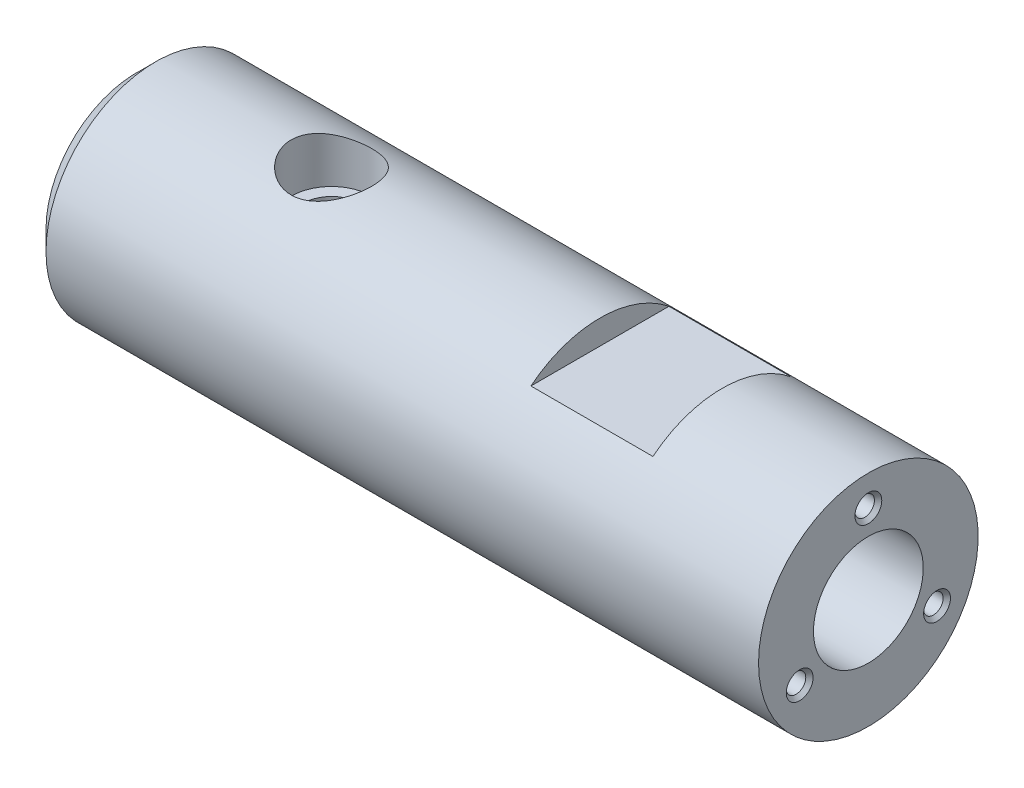
ISO-10303-21;
HEADER;
FILE_DESCRIPTION(('STEP AP214'),'2;1');
FILE_NAME('part.step','',(''),(''),'','','');
FILE_SCHEMA(('AUTOMOTIVE_DESIGN { 1 0 10303 214 1 1 1 1 }'));
ENDSEC;
DATA;
#1=APPLICATION_CONTEXT('core data for automotive mechanical design processes');
#2=APPLICATION_PROTOCOL_DEFINITION('international standard','automotive_design',2000,#1);
#3=PRODUCT_CONTEXT('',#1,'mechanical');
#4=PRODUCT('Part','Part','',(#3));
#5=PRODUCT_RELATED_PRODUCT_CATEGORY('part','',(#4));
#6=PRODUCT_DEFINITION_FORMATION('','',#4);
#7=PRODUCT_DEFINITION_CONTEXT('part definition',#1,'design');
#8=PRODUCT_DEFINITION('design','',#6,#7);
#9=PRODUCT_DEFINITION_SHAPE('','',#8);
#10=(LENGTH_UNIT() NAMED_UNIT(*) SI_UNIT(.MILLI.,.METRE.));
#11=(NAMED_UNIT(*) PLANE_ANGLE_UNIT() SI_UNIT($,.RADIAN.));
#12=(NAMED_UNIT(*) SI_UNIT($,.STERADIAN.) SOLID_ANGLE_UNIT());
#13=UNCERTAINTY_MEASURE_WITH_UNIT(LENGTH_MEASURE(1.E-05),#10,'distance_accuracy_value','');
#14=(GEOMETRIC_REPRESENTATION_CONTEXT(3) GLOBAL_UNCERTAINTY_ASSIGNED_CONTEXT((#13)) GLOBAL_UNIT_ASSIGNED_CONTEXT((#10,
#11,#12)) REPRESENTATION_CONTEXT('',''));
#15=CARTESIAN_POINT('',(0.,0.,0.));
#16=DIRECTION('',(0.,0.,1.));
#17=DIRECTION('',(1.,0.,0.));
#18=AXIS2_PLACEMENT_3D('',#15,#16,#17);
#19=CARTESIAN_POINT('',(-16.,0.,0.));
#20=DIRECTION('',(-1.,0.,0.));
#21=DIRECTION('',(0.,0.,1.));
#22=AXIS2_PLACEMENT_3D('',#19,#20,#21);
#23=CYLINDRICAL_SURFACE('',#22,2.55);
#24=CARTESIAN_POINT('',(-13.,0.,0.));
#25=DIRECTION('',(-1.,0.,0.));
#26=DIRECTION('',(0.,0.,1.));
#27=AXIS2_PLACEMENT_3D('',#24,#25,#26);
#28=CIRCLE('',#27,2.55);
#29=CARTESIAN_POINT('',(-13.,0.,2.55));
#30=VERTEX_POINT('',#29);
#31=EDGE_CURVE('E160',#30,#30,#28,.T.);
#32=ORIENTED_EDGE('',*,*,#31,.F.);
#33=EDGE_LOOP('',(#32));
#34=FACE_BOUND('',#33,.T.);
#35=CARTESIAN_POINT('',(-16.,0.,0.));
#36=DIRECTION('',(-1.,0.,0.));
#37=DIRECTION('',(0.,0.,1.));
#38=AXIS2_PLACEMENT_3D('',#35,#36,#37);
#39=CIRCLE('',#38,2.55);
#40=CARTESIAN_POINT('',(-16.,0.,2.55));
#41=VERTEX_POINT('',#40);
#42=EDGE_CURVE('E190',#41,#41,#39,.T.);
#43=ORIENTED_EDGE('',*,*,#42,.T.);
#44=EDGE_LOOP('',(#43));
#45=FACE_BOUND('',#44,.T.);
#46=ADVANCED_FACE('F52',(#34,#45),#23,.F.);
#47=CARTESIAN_POINT('',(-16.,2.55,0.));
#48=DIRECTION('',(1.,0.,0.));
#49=DIRECTION('',(0.,0.,-1.));
#50=AXIS2_PLACEMENT_3D('',#47,#48,#49);
#51=PLANE('',#50);
#52=ORIENTED_EDGE('',*,*,#42,.F.);
#53=EDGE_LOOP('',(#52));
#54=FACE_BOUND('',#53,.T.);
#55=CARTESIAN_POINT('',(-16.,0.,0.));
#56=DIRECTION('',(-1.,0.,0.));
#57=DIRECTION('',(0.,0.,1.));
#58=AXIS2_PLACEMENT_3D('',#55,#56,#57);
#59=CIRCLE('',#58,4.75);
#60=CARTESIAN_POINT('',(-16.,0.,4.75));
#61=VERTEX_POINT('',#60);
#62=EDGE_CURVE('E187',#61,#61,#59,.T.);
#63=ORIENTED_EDGE('',*,*,#62,.T.);
#64=EDGE_LOOP('',(#63));
#65=FACE_BOUND('',#64,.T.);
#66=ADVANCED_FACE('F236',(#54,#65),#51,.F.);
#67=CARTESIAN_POINT('',(-16.,0.,0.));
#68=DIRECTION('',(-1.,0.,0.));
#69=DIRECTION('',(0.,0.,1.));
#70=AXIS2_PLACEMENT_3D('',#67,#68,#69);
#71=CYLINDRICAL_SURFACE('',#70,4.75);
#72=ORIENTED_EDGE('',*,*,#62,.F.);
#73=EDGE_LOOP('',(#72));
#74=FACE_BOUND('',#73,.T.);
#75=CARTESIAN_POINT('',(-14.6,0.,0.));
#76=DIRECTION('',(-1.,0.,0.));
#77=DIRECTION('',(0.,0.,1.));
#78=AXIS2_PLACEMENT_3D('',#75,#76,#77);
#79=CIRCLE('',#78,4.75);
#80=CARTESIAN_POINT('',(-14.6,0.,4.75));
#81=VERTEX_POINT('',#80);
#82=EDGE_CURVE('E184',#81,#81,#79,.T.);
#83=ORIENTED_EDGE('',*,*,#82,.T.);
#84=EDGE_LOOP('',(#83));
#85=FACE_BOUND('',#84,.T.);
#86=ADVANCED_FACE('F241',(#74,#85),#71,.T.);
#87=CARTESIAN_POINT('',(-14.6,4.75,0.));
#88=DIRECTION('',(1.,0.,0.));
#89=DIRECTION('',(0.,0.,-1.));
#90=AXIS2_PLACEMENT_3D('',#87,#88,#89);
#91=PLANE('',#90);
#92=ORIENTED_EDGE('',*,*,#82,.F.);
#93=EDGE_LOOP('',(#92));
#94=FACE_BOUND('',#93,.T.);
#95=CARTESIAN_POINT('',(-14.6,0.,0.));
#96=DIRECTION('',(-1.,0.,0.));
#97=DIRECTION('',(0.,0.,1.));
#98=AXIS2_PLACEMENT_3D('',#95,#96,#97);
#99=CIRCLE('',#98,6.75);
#100=CARTESIAN_POINT('',(-14.6,0.,6.75));
#101=VERTEX_POINT('',#100);
#102=EDGE_CURVE('E181',#101,#101,#99,.T.);
#103=ORIENTED_EDGE('',*,*,#102,.T.);
#104=EDGE_LOOP('',(#103));
#105=FACE_BOUND('',#104,.T.);
#106=ADVANCED_FACE('F251',(#94,#105),#91,.F.);
#107=CARTESIAN_POINT('',(-16.,0.,0.));
#108=DIRECTION('',(-1.,0.,0.));
#109=DIRECTION('',(0.,0.,1.));
#110=AXIS2_PLACEMENT_3D('',#107,#108,#109);
#111=CYLINDRICAL_SURFACE('',#110,6.75);
#112=ORIENTED_EDGE('',*,*,#102,.F.);
#113=EDGE_LOOP('',(#112));
#114=FACE_BOUND('',#113,.T.);
#115=CARTESIAN_POINT('',(-16.,0.,0.));
#116=DIRECTION('',(-1.,0.,0.));
#117=DIRECTION('',(0.,0.,1.));
#118=AXIS2_PLACEMENT_3D('',#115,#116,#117);
#119=CIRCLE('',#118,6.75);
#120=CARTESIAN_POINT('',(-16.,0.,6.75));
#121=VERTEX_POINT('',#120);
#122=EDGE_CURVE('E178',#121,#121,#119,.T.);
#123=ORIENTED_EDGE('',*,*,#122,.T.);
#124=EDGE_LOOP('',(#123));
#125=FACE_BOUND('',#124,.T.);
#126=ADVANCED_FACE('F257',(#114,#125),#111,.F.);
#127=CARTESIAN_POINT('',(-16.,6.75,0.));
#128=DIRECTION('',(1.,0.,0.));
#129=DIRECTION('',(0.,0.,-1.));
#130=AXIS2_PLACEMENT_3D('',#127,#128,#129);
#131=PLANE('',#130);
#132=ORIENTED_EDGE('',*,*,#122,.F.);
#133=EDGE_LOOP('',(#132));
#134=FACE_BOUND('',#133,.T.);
#135=CARTESIAN_POINT('',(-16.,0.,0.));
#136=DIRECTION('',(-1.,0.,0.));
#137=DIRECTION('',(0.,0.,1.));
#138=AXIS2_PLACEMENT_3D('',#135,#136,#137);
#139=CIRCLE('',#138,7.4);
#140=CARTESIAN_POINT('',(-16.,0.,7.4));
#141=VERTEX_POINT('',#140);
#142=EDGE_CURVE('E175',#141,#141,#139,.T.);
#143=ORIENTED_EDGE('',*,*,#142,.T.);
#144=EDGE_LOOP('',(#143));
#145=FACE_BOUND('',#144,.T.);
#146=ADVANCED_FACE('F263',(#134,#145),#131,.F.);
#147=CARTESIAN_POINT('',(-14.4,0.,0.));
#148=DIRECTION('',(1.,0.,0.));
#149=DIRECTION('',(0.,0.,-1.));
#150=AXIS2_PLACEMENT_3D('',#147,#148,#149);
#151=CONICAL_SURFACE('',#150,9.,0.785398163397448);
#152=ORIENTED_EDGE('',*,*,#142,.F.);
#153=EDGE_LOOP('',(#152));
#154=FACE_BOUND('',#153,.T.);
#155=CARTESIAN_POINT('',(-14.4,0.,0.));
#156=DIRECTION('',(-1.,0.,0.));
#157=DIRECTION('',(0.,0.,1.));
#158=AXIS2_PLACEMENT_3D('',#155,#156,#157);
#159=CIRCLE('',#158,9.);
#160=CARTESIAN_POINT('',(-14.4,0.,9.));
#161=VERTEX_POINT('',#160);
#162=EDGE_CURVE('E172',#161,#161,#159,.T.);
#163=ORIENTED_EDGE('',*,*,#162,.T.);
#164=EDGE_LOOP('',(#163));
#165=FACE_BOUND('',#164,.T.);
#166=ADVANCED_FACE('F269',(#154,#165),#151,.T.);
#167=CARTESIAN_POINT('',(-16.,0.,0.));
#168=DIRECTION('',(-1.,0.,0.));
#169=DIRECTION('',(0.,0.,1.));
#170=AXIS2_PLACEMENT_3D('',#167,#168,#169);
#171=CYLINDRICAL_SURFACE('',#170,9.);
#172=DIRECTION('',(-1.,0.,0.));
#173=VECTOR('',#172,1.);
#174=CARTESIAN_POINT('',(-16.,-7.,5.65685424949238));
#175=LINE('',#174,#173);
#176=CARTESIAN_POINT('',(22.,-7.,5.65685424949238));
#177=VERTEX_POINT('',#176);
#178=CARTESIAN_POINT('',(32.,-7.,5.65685424949238));
#179=VERTEX_POINT('',#178);
#180=EDGE_CURVE('E66',#177,#179,#175,.F.);
#181=ORIENTED_EDGE('',*,*,#180,.T.);
#182=CARTESIAN_POINT('',(32.,0.,0.));
#183=DIRECTION('',(1.,0.,0.));
#184=DIRECTION('',(0.,0.,1.));
#185=AXIS2_PLACEMENT_3D('',#182,#183,#184);
#186=CIRCLE('',#185,9.);
#187=CARTESIAN_POINT('',(32.,-7.,-5.65685424949238));
#188=VERTEX_POINT('',#187);
#189=EDGE_CURVE('E137',#179,#188,#186,.T.);
#190=ORIENTED_EDGE('',*,*,#189,.T.);
#191=DIRECTION('',(-1.,0.,0.));
#192=VECTOR('',#191,1.);
#193=CARTESIAN_POINT('',(-16.,-7.,-5.65685424949238));
#194=LINE('',#193,#192);
#195=CARTESIAN_POINT('',(22.,-7.,-5.65685424949238));
#196=VERTEX_POINT('',#195);
#197=EDGE_CURVE('E134',#188,#196,#194,.T.);
#198=ORIENTED_EDGE('',*,*,#197,.T.);
#199=CARTESIAN_POINT('',(22.,0.,0.));
#200=DIRECTION('',(-1.,0.,0.));
#201=DIRECTION('',(0.,0.,-1.));
#202=AXIS2_PLACEMENT_3D('',#199,#200,#201);
#203=CIRCLE('',#202,9.);
#204=EDGE_CURVE('E126',#196,#177,#203,.T.);
#205=ORIENTED_EDGE('',*,*,#204,.T.);
#206=EDGE_LOOP('',(#181,#190,#198,#205));
#207=FACE_BOUND('',#206,.T.);
#208=DIRECTION('',(-1.,0.,0.));
#209=VECTOR('',#208,1.);
#210=CARTESIAN_POINT('',(-16.,7.,-5.65685424949238));
#211=LINE('',#210,#209);
#212=CARTESIAN_POINT('',(22.,7.,-5.65685424949238));
#213=VERTEX_POINT('',#212);
#214=CARTESIAN_POINT('',(32.,7.,-5.65685424949238));
#215=VERTEX_POINT('',#214);
#216=EDGE_CURVE('E332',#213,#215,#211,.F.);
#217=ORIENTED_EDGE('',*,*,#216,.T.);
#218=CARTESIAN_POINT('',(32.,0.,0.));
#219=DIRECTION('',(1.,0.,0.));
#220=DIRECTION('',(0.,0.,-1.));
#221=AXIS2_PLACEMENT_3D('',#218,#219,#220);
#222=CIRCLE('',#221,9.);
#223=CARTESIAN_POINT('',(32.,7.,5.65685424949238));
#224=VERTEX_POINT('',#223);
#225=EDGE_CURVE('E13',#215,#224,#222,.T.);
#226=ORIENTED_EDGE('',*,*,#225,.T.);
#227=DIRECTION('',(-1.,0.,0.));
#228=VECTOR('',#227,1.);
#229=CARTESIAN_POINT('',(-16.,7.,5.65685424949238));
#230=LINE('',#229,#228);
#231=CARTESIAN_POINT('',(22.,7.,5.65685424949238));
#232=VERTEX_POINT('',#231);
#233=EDGE_CURVE('E59',#224,#232,#230,.T.);
#234=ORIENTED_EDGE('',*,*,#233,.T.);
#235=CARTESIAN_POINT('',(22.,0.,0.));
#236=DIRECTION('',(-1.,0.,0.));
#237=DIRECTION('',(0.,0.,1.));
#238=AXIS2_PLACEMENT_3D('',#235,#236,#237);
#239=CIRCLE('',#238,9.);
#240=EDGE_CURVE('E337',#232,#213,#239,.T.);
#241=ORIENTED_EDGE('',*,*,#240,.T.);
#242=EDGE_LOOP('',(#217,#226,#234,#241));
#243=FACE_BOUND('',#242,.T.);
#244=CARTESIAN_POINT('',(-3.3,9.,0.));
#245=CARTESIAN_POINT('',(-3.30000508781298,9.00000374624331,-0.178996081097543));
#246=CARTESIAN_POINT('',(-3.28539058285784,8.99461300088635,-0.357956583142177));
#247=CARTESIAN_POINT('',(-3.22754308326872,8.97364526029598,-0.710544732766354));
#248=CARTESIAN_POINT('',(-3.18431280249457,8.95806923101512,-0.884172884420973));
#249=CARTESIAN_POINT('',(-3.07095774485288,8.91840719859286,-1.22096141565027));
#250=CARTESIAN_POINT('',(-3.00088343532168,8.89433717099872,-1.38414077131049));
#251=CARTESIAN_POINT('',(-2.83608023685542,8.84009670554161,-1.69642007041734));
#252=CARTESIAN_POINT('',(-2.74134505505552,8.80992471104167,-1.84551640696055));
#253=CARTESIAN_POINT('',(-2.52586009542823,8.7452294450339,-2.13149150668284));
#254=CARTESIAN_POINT('',(-2.40428039160077,8.71058680789296,-2.26771767493087));
#255=CARTESIAN_POINT('',(-2.14031969514787,8.64145601021113,-2.51836737017338));
#256=CARTESIAN_POINT('',(-1.99793275602732,8.60696789674532,-2.63278464279549));
#257=CARTESIAN_POINT('',(-1.69012844573402,8.54067830638993,-2.84062807047463));
#258=CARTESIAN_POINT('',(-1.52406545189303,8.50901867472574,-2.9331478315342));
#259=CARTESIAN_POINT('',(-1.17739124804041,8.45381918571778,-3.08865685844749));
#260=CARTESIAN_POINT('',(-0.996785589101169,8.43027624810958,-3.15165733006173));
#261=CARTESIAN_POINT('',(-0.63364934231755,8.39524788393202,-3.24378945322021));
#262=CARTESIAN_POINT('',(-0.451477507152517,8.38332233456965,-3.2741622811962));
#263=CARTESIAN_POINT('',(-0.0842625728511823,8.37158791259722,-3.3040580396176));
#264=CARTESIAN_POINT('',(0.10077937825288,8.37177431416379,-3.30359300233489));
#265=CARTESIAN_POINT('',(0.457294707141335,8.38386193844309,-3.27277829559756));
#266=CARTESIAN_POINT('',(0.628941685804497,8.39509699367467,-3.24412799259436));
#267=CARTESIAN_POINT('',(0.964796765499864,8.4269124654355,-3.16055761651623));
#268=CARTESIAN_POINT('',(1.12900379231987,8.44749422678333,-3.1056337631014));
#269=CARTESIAN_POINT('',(1.44886294983971,8.49610005163989,-2.97010598621301));
#270=CARTESIAN_POINT('',(1.60430231279614,8.52425397712158,-2.88904852749292));
#271=CARTESIAN_POINT('',(1.89987522082002,8.58478632795731,-2.70387019416919));
#272=CARTESIAN_POINT('',(2.04000362528669,8.61716616418778,-2.59974160882705));
#273=CARTESIAN_POINT('',(2.31041458044699,8.6850322503293,-2.36352186341457));
#274=CARTESIAN_POINT('',(2.43949223971974,8.72058465333178,-2.23006719282499));
#275=CARTESIAN_POINT('',(2.67378450497196,8.78900126582342,-1.94298935279094));
#276=CARTESIAN_POINT('',(2.77899575881286,8.8218650972773,-1.78936335497568));
#277=CARTESIAN_POINT('',(2.96381990543019,8.88180485116844,-1.46333931900251));
#278=CARTESIAN_POINT('',(3.04304800245433,8.9087919388309,-1.29070565256432));
#279=CARTESIAN_POINT('',(3.17094291788866,8.95328193832913,-0.933326018323247));
#280=CARTESIAN_POINT('',(3.21962268882627,8.97078886933062,-0.748585220704586));
#281=CARTESIAN_POINT('',(3.28276092084082,8.99364793452057,-0.382388588284957));
#282=CARTESIAN_POINT('',(3.29884299824701,8.99957618066676,-0.201248367339023));
#283=CARTESIAN_POINT('',(3.30103560224733,9.00037930662147,0.161217560932457));
#284=CARTESIAN_POINT('',(3.28715242996434,8.99525651025446,0.342543221249425));
#285=CARTESIAN_POINT('',(3.23105424957248,8.97491365411456,0.693325218478854));
#286=CARTESIAN_POINT('',(3.18988880640042,8.96006788350165,0.862973354437797));
#287=CARTESIAN_POINT('',(3.08176193671764,8.92214682971263,1.19284691001399));
#288=CARTESIAN_POINT('',(3.01479715385317,8.89907047581142,1.35307110049977));
#289=CARTESIAN_POINT('',(2.85486469395423,8.84615215853868,1.66472528393021));
#290=CARTESIAN_POINT('',(2.76120224394116,8.81613413434072,1.81576794058343));
#291=CARTESIAN_POINT('',(2.55132432986142,8.75267170462699,2.10048810550673));
#292=CARTESIAN_POINT('',(2.43510080777703,8.71922607691314,2.23415938077047));
#293=CARTESIAN_POINT('',(2.17581284908199,8.65030131867371,2.4880826725656));
#294=CARTESIAN_POINT('',(2.03161792828496,8.6148122067691,2.6071805868609));
#295=CARTESIAN_POINT('',(1.72457400609422,8.54761704594161,2.81969900934448));
#296=CARTESIAN_POINT('',(1.5617237102065,8.51591125985523,2.91311773412629));
#297=CARTESIAN_POINT('',(1.22095515415892,8.46005121009329,3.07158764530994));
#298=CARTESIAN_POINT('',(1.04299847862728,8.43591697900601,3.13656375548093));
#299=CARTESIAN_POINT('',(0.677545382278833,8.39857948094942,3.23522789797559));
#300=CARTESIAN_POINT('',(0.490054579817605,8.38536985368313,3.26893413699107));
#301=CARTESIAN_POINT('',(0.123298367953439,8.3721976745236,3.30251420354945));
#302=CARTESIAN_POINT('',(-0.0557619503585283,8.37146896962303,3.3043448660091));
#303=CARTESIAN_POINT('',(-0.41149386026058,8.3813913232323,3.27909435742939));
#304=CARTESIAN_POINT('',(-0.588165657060374,8.39204139776188,3.2520156863256));
#305=CARTESIAN_POINT('',(-0.929122903159166,8.42289675837679,3.17121236525121));
#306=CARTESIAN_POINT('',(-1.09361636409024,8.44282734184701,3.11825172283106));
#307=CARTESIAN_POINT('',(-1.41148698355416,8.48984943342684,2.98784827852083));
#308=CARTESIAN_POINT('',(-1.56486138137524,8.51694271222976,2.91039942195859));
#309=CARTESIAN_POINT('',(-1.86459177975,8.5769478154702,2.72865424490592));
#310=CARTESIAN_POINT('',(-2.01019731398357,8.61008504971034,2.6231955145421));
#311=CARTESIAN_POINT('',(-2.28227189337951,8.67763579125675,2.39025719942837));
#312=CARTESIAN_POINT('',(-2.40873497171964,8.71204969236317,2.26277077491862));
#313=CARTESIAN_POINT('',(-2.6454719756443,8.78037650263238,1.98164591936092));
#314=CARTESIAN_POINT('',(-2.75459688442235,8.81417511679906,1.82700784833618));
#315=CARTESIAN_POINT('',(-2.94525281459605,8.87560403928975,1.50041058174008));
#316=CARTESIAN_POINT('',(-3.02678372337007,8.90323432243828,1.32845131547803));
#317=CARTESIAN_POINT('',(-3.16100397195145,8.94974057764081,0.96748081910894));
#318=CARTESIAN_POINT('',(-3.2129282707554,8.96838256440539,0.77815255925407));
#319=CARTESIAN_POINT('',(-3.2824158262507,8.99350750805694,0.392533178617056));
#320=CARTESIAN_POINT('',(-3.29999442189516,8.99999589274644,0.196245205972797));
#321=CARTESIAN_POINT('',(-3.3,9.,0.));
#322=B_SPLINE_CURVE_WITH_KNOTS('',3,(#244,#245,#246,#247,#248,#249,#250,#251,#252,#253,#254,
#255,#256,#257,#258,#259,#260,#261,#262,#263,#264,#265,#266,#267,#268,#269,#270,#271,#272,#273,
#274,#275,#276,#277,#278,#279,#280,#281,#282,#283,#284,#285,#286,#287,#288,#289,#290,#291,#292,
#293,#294,#295,#296,#297,#298,#299,#300,#301,#302,#303,#304,#305,#306,#307,#308,#309,#310,#311,
#312,#313,#314,#315,#316,#317,#318,#319,#320,#321),.UNSPECIFIED.,.T.,.F.,(4,2,2,2,2,2,2,2,2,2,2,
2,2,2,2,2,2,2,2,2,2,2,2,2,2,2,2,2,2,2,2,2,2,2,2,2,2,2,4),(0.,0.536264723219218,1.07247859550805,
1.60768928297927,2.143036677525,2.69810968759034,3.25334164321797,3.82860807471781,
4.40365595316264,4.95595650544504,5.50804156319737,6.02876046236663,6.54955430712822,
7.07992232761484,7.61046787365557,8.1749834346801,8.73957823530028,9.3121919456149,
9.88456270268505,10.4276457668225,10.9706146420325,11.4938214585784,12.0170963644817,
12.5554754517891,13.0940471840641,13.6624637408979,14.2309197640003,14.800867348478,
15.3704828757951,15.9049974442095,16.4394657942024,16.9590318461752,17.4787264606175,
18.0247784838855,18.5710003659981,19.1449750630037,19.7189521025904,20.3071572330341,
20.8950996081901),.UNSPECIFIED.);
#323=CARTESIAN_POINT('',(-3.3,9.,0.));
#324=VERTEX_POINT('',#323);
#325=EDGE_CURVE('E193',#324,#324,#322,.T.);
#326=ORIENTED_EDGE('',*,*,#325,.T.);
#327=EDGE_LOOP('',(#326));
#328=FACE_BOUND('',#327,.T.);
#329=ORIENTED_EDGE('',*,*,#162,.F.);
#330=EDGE_LOOP('',(#329));
#331=FACE_BOUND('',#330,.T.);
#332=CARTESIAN_POINT('',(44.,0.,0.));
#333=DIRECTION('',(-1.,0.,0.));
#334=DIRECTION('',(0.,0.,1.));
#335=AXIS2_PLACEMENT_3D('',#332,#333,#334);
#336=CIRCLE('',#335,9.);
#337=CARTESIAN_POINT('',(44.,0.,9.));
#338=VERTEX_POINT('',#337);
#339=EDGE_CURVE('E169',#338,#338,#336,.T.);
#340=ORIENTED_EDGE('',*,*,#339,.T.);
#341=EDGE_LOOP('',(#340));
#342=FACE_BOUND('',#341,.T.);
#343=ADVANCED_FACE('F275',(#207,#243,#328,#331,#342),#171,.T.);
#344=CARTESIAN_POINT('',(44.,9.,0.));
#345=DIRECTION('',(-1.,0.,0.));
#346=DIRECTION('',(0.,0.,1.));
#347=AXIS2_PLACEMENT_3D('',#344,#345,#346);
#348=PLANE('',#347);
#349=CARTESIAN_POINT('',(44.,-3.24999999999995,-5.62916512459888));
#350=DIRECTION('',(1.,0.,0.));
#351=DIRECTION('',(0.,-0.866025403784443,0.499999999999992));
#352=AXIS2_PLACEMENT_3D('',#349,#350,#351);
#353=CIRCLE('',#352,1.1);
#354=CARTESIAN_POINT('',(44.,-4.20262794416284,-5.07916512459889));
#355=VERTEX_POINT('',#354);
#356=EDGE_CURVE('E117',#355,#355,#353,.T.);
#357=ORIENTED_EDGE('',*,*,#356,.F.);
#358=EDGE_LOOP('',(#357));
#359=FACE_BOUND('',#358,.T.);
#360=CARTESIAN_POINT('',(44.,-3.25000000000003,5.62916512459884));
#361=DIRECTION('',(1.,0.,0.));
#362=DIRECTION('',(0.,0.866025403784436,0.500000000000004));
#363=AXIS2_PLACEMENT_3D('',#360,#361,#362);
#364=CIRCLE('',#363,1.1);
#365=CARTESIAN_POINT('',(44.,-2.29737205583715,6.17916512459884));
#366=VERTEX_POINT('',#365);
#367=EDGE_CURVE('E110',#366,#366,#364,.T.);
#368=ORIENTED_EDGE('',*,*,#367,.F.);
#369=EDGE_LOOP('',(#368));
#370=FACE_BOUND('',#369,.T.);
#371=CARTESIAN_POINT('',(44.,6.5,0.));
#372=DIRECTION('',(1.,0.,0.));
#373=DIRECTION('',(0.,0.,-1.));
#374=AXIS2_PLACEMENT_3D('',#371,#372,#373);
#375=CIRCLE('',#374,1.1);
#376=CARTESIAN_POINT('',(44.,6.5,-1.1));
#377=VERTEX_POINT('',#376);
#378=EDGE_CURVE('E140',#377,#377,#375,.T.);
#379=ORIENTED_EDGE('',*,*,#378,.F.);
#380=EDGE_LOOP('',(#379));
#381=FACE_BOUND('',#380,.T.);
#382=ORIENTED_EDGE('',*,*,#339,.F.);
#383=EDGE_LOOP('',(#382));
#384=FACE_BOUND('',#383,.T.);
#385=CARTESIAN_POINT('',(44.,0.,0.));
#386=DIRECTION('',(-1.,0.,0.));
#387=DIRECTION('',(0.,0.,1.));
#388=AXIS2_PLACEMENT_3D('',#385,#386,#387);
#389=CIRCLE('',#388,4.5);
#390=CARTESIAN_POINT('',(44.,0.,4.5));
#391=VERTEX_POINT('',#390);
#392=EDGE_CURVE('E166',#391,#391,#389,.T.);
#393=ORIENTED_EDGE('',*,*,#392,.T.);
#394=EDGE_LOOP('',(#393));
#395=FACE_BOUND('',#394,.T.);
#396=ADVANCED_FACE('F231',(#359,#370,#381,#384,#395),#348,.F.);
#397=CARTESIAN_POINT('',(-16.,0.,0.));
#398=DIRECTION('',(-1.,0.,0.));
#399=DIRECTION('',(0.,0.,1.));
#400=AXIS2_PLACEMENT_3D('',#397,#398,#399);
#401=CYLINDRICAL_SURFACE('',#400,4.5);
#402=CARTESIAN_POINT('',(0.,3.86781592116274,-2.3));
#403=CARTESIAN_POINT('',(-0.119425571306521,3.8678284409669,-2.29998994139462));
#404=CARTESIAN_POINT('',(-0.238997402978812,3.87343264930265,-2.29063488968329));
#405=CARTESIAN_POINT('',(-0.474434445509548,3.89502824387451,-2.25370392077934));
#406=CARTESIAN_POINT('',(-0.590291726168681,3.91104047779871,-2.22609143129821));
#407=CARTESIAN_POINT('',(-0.814448513061045,3.9511026776379,-2.15417171605832));
#408=CARTESIAN_POINT('',(-0.922785806708141,3.97510831169363,-2.1099564015256));
#409=CARTESIAN_POINT('',(-1.13047544703175,4.0283835369502,-2.00636698553421));
#410=CARTESIAN_POINT('',(-1.22982696848564,4.05765361088302,-1.94699149372704));
#411=CARTESIAN_POINT('',(-1.4261967485385,4.12124615866801,-1.80875564317872));
#412=CARTESIAN_POINT('',(-1.52227169168486,4.15578665992316,-1.72865499619346));
#413=CARTESIAN_POINT('',(-1.70036254966525,4.22427130237948,-1.55381793661317));
#414=CARTESIAN_POINT('',(-1.78237117631935,4.25821512629884,-1.45907398492255));
#415=CARTESIAN_POINT('',(-1.93572588350541,4.32457127883758,-1.24940013437797));
#416=CARTESIAN_POINT('',(-2.00589662894114,4.3567023680064,-1.13351316785474));
#417=CARTESIAN_POINT('',(-2.12531366663883,4.41295546563751,-0.889628334370852));
#418=CARTESIAN_POINT('',(-2.17457374695567,4.43708274934057,-0.761638516078386));
#419=CARTESIAN_POINT('',(-2.24698507536414,4.47303375988796,-0.507187875984931));
#420=CARTESIAN_POINT('',(-2.27179483727736,4.48563406939422,-0.381311279215276));
#421=CARTESIAN_POINT('',(-2.30007835272377,4.50002252763808,-0.126601673746005));
#422=CARTESIAN_POINT('',(-2.30356568845356,4.50181755923071,0.00222940046298503));
#423=CARTESIAN_POINT('',(-2.28971052141778,4.49474752805745,0.246657997139841));
#424=CARTESIAN_POINT('',(-2.27423003412244,4.48683530465449,0.362395253030004));
#425=CARTESIAN_POINT('',(-2.22623200718177,4.46269868243465,0.589361761819122));
#426=CARTESIAN_POINT('',(-2.19371318731235,4.44647365901367,0.700590675294124));
#427=CARTESIAN_POINT('',(-2.11239078625263,4.40691729121661,0.917269380792568));
#428=CARTESIAN_POINT('',(-2.06337622988635,4.38349424216952,1.02262255581545));
#429=CARTESIAN_POINT('',(-1.95076631873526,4.33162712261702,1.2238545993793));
#430=CARTESIAN_POINT('',(-1.88716583180181,4.30318128562546,1.31973011611612));
#431=CARTESIAN_POINT('',(-1.74007165745053,4.24063594658362,1.50927552632954));
#432=CARTESIAN_POINT('',(-1.65524223565604,4.20625561502648,1.60181686106149));
#433=CARTESIAN_POINT('',(-1.47165301831012,4.13745302974617,1.7719830879646));
#434=CARTESIAN_POINT('',(-1.37288178737839,4.10303076483792,1.84959561047389));
#435=CARTESIAN_POINT('',(-1.15595537729899,4.03545634733204,1.99293683641265));
#436=CARTESIAN_POINT('',(-1.03693560204051,4.00255297634776,2.05748633902124));
#437=CARTESIAN_POINT('',(-0.78767456054709,3.94535253813963,2.16516660075231));
#438=CARTESIAN_POINT('',(-0.657445581056241,3.92104619313941,2.20832047004734));
#439=CARTESIAN_POINT('',(-0.400409787666044,3.88657445808257,2.26840434100571));
#440=CARTESIAN_POINT('',(-0.274166333802489,3.87543119745271,2.28716012801525));
#441=CARTESIAN_POINT('',(-0.0198767491531188,3.86578713393014,2.30343228613247));
#442=CARTESIAN_POINT('',(0.108167890704922,3.86727642599304,2.30096529776128));
#443=CARTESIAN_POINT('',(0.346450170636627,3.88168984074737,2.2765377954171));
#444=CARTESIAN_POINT('',(0.457020846328892,3.89325805185908,2.2568877908424));
#445=CARTESIAN_POINT('',(0.673064727384149,3.92448416719573,2.20213750623858));
#446=CARTESIAN_POINT('',(0.778536168238451,3.94414484961694,2.16703191992269));
#447=CARTESIAN_POINT('',(0.986922895400154,3.99038870598004,2.08069462267553));
#448=CARTESIAN_POINT('',(1.08949820858671,4.01724838375812,2.02879622250683));
#449=CARTESIAN_POINT('',(1.28508490733121,4.07463921797217,1.91091887373761));
#450=CARTESIAN_POINT('',(1.37809132930866,4.10517226222286,1.84493267153189));
#451=CARTESIAN_POINT('',(1.56483748943248,4.17134329543869,1.69051590227466));
#452=CARTESIAN_POINT('',(1.65703223294036,4.20712047769361,1.60026800873368));
#453=CARTESIAN_POINT('',(1.82548301729745,4.27626991034748,1.40507515532087));
#454=CARTESIAN_POINT('',(1.90173288566915,4.30964122613941,1.30012452997919));
#455=CARTESIAN_POINT('',(2.03818701174834,4.3715433170889,1.07412197869082));
#456=CARTESIAN_POINT('',(2.09781969740648,4.39989167226806,0.952671362866501));
#457=CARTESIAN_POINT('',(2.19519931878252,4.44714242422611,0.699596109902917));
#458=CARTESIAN_POINT('',(2.23296630401724,4.4660534722374,0.567980918995592));
#459=CARTESIAN_POINT('',(2.28215499498753,4.49086086222452,0.31170339418298));
#460=CARTESIAN_POINT('',(2.29572476315423,4.4978161010908,0.187555369847478));
#461=CARTESIAN_POINT('',(2.30254569867464,4.50130003578083,-0.0614253863131443));
#462=CARTESIAN_POINT('',(2.29580465741626,4.49783272977682,-0.186257837248117));
#463=CARTESIAN_POINT('',(2.26357913192332,4.48147557951101,-0.423737120823862));
#464=CARTESIAN_POINT('',(2.23945519554105,4.46927009124124,-0.53662103265896));
#465=CARTESIAN_POINT('',(2.17503780907327,4.43734253582188,-0.756534609192136));
#466=CARTESIAN_POINT('',(2.13474213612084,4.41761943536655,-0.863563466791602));
#467=CARTESIAN_POINT('',(2.03742028754075,4.37140419959618,-1.07372412892947));
#468=CARTESIAN_POINT('',(1.97977093049774,4.34466578277969,-1.17651152960291));
#469=CARTESIAN_POINT('',(1.85015428671231,4.28715483469007,-1.37136461450394));
#470=CARTESIAN_POINT('',(1.77818050052765,4.25638047435258,-1.46342540155837));
#471=CARTESIAN_POINT('',(1.61334696692403,4.1900628232179,-1.64425613306175));
#472=CARTESIAN_POINT('',(1.51909762543047,4.15435531778387,-1.73170339706203));
#473=CARTESIAN_POINT('',(1.31688538873572,4.08474655218386,-1.89006418247263));
#474=CARTESIAN_POINT('',(1.20890955194597,4.05084704000694,-1.96096191942085));
#475=CARTESIAN_POINT('',(0.976718101873968,3.98762030671489,-2.08663638648064));
#476=CARTESIAN_POINT('',(0.852036375650874,3.95852020982756,-2.14068483586153));
#477=CARTESIAN_POINT('',(0.65828104065617,3.92291787278042,-2.20483622549544));
#478=CARTESIAN_POINT('',(0.592635509958841,3.91239755091014,-2.22339075426154));
#479=CARTESIAN_POINT('',(0.459567071371386,3.8944667528377,-2.25465231637267));
#480=CARTESIAN_POINT('',(0.392145419644651,3.88705413830444,-2.26736337104067));
#481=CARTESIAN_POINT('',(0.270607534791298,3.87690331326722,-2.28466591551903));
#482=CARTESIAN_POINT('',(0.216706990382507,3.87350665878014,-2.2904085779042));
#483=CARTESIAN_POINT('',(0.108547721012749,3.86896004284649,-2.29807803245952));
#484=CARTESIAN_POINT('',(0.054288972621399,3.86781022985813,-2.30000457248264));
#485=CARTESIAN_POINT('',(0.,3.86781592116274,-2.3));
#486=B_SPLINE_CURVE_WITH_KNOTS('',3,(#402,#403,#404,#405,#406,#407,#408,#409,#410,#411,#412,
#413,#414,#415,#416,#417,#418,#419,#420,#421,#422,#423,#424,#425,#426,#427,#428,#429,#430,#431,
#432,#433,#434,#435,#436,#437,#438,#439,#440,#441,#442,#443,#444,#445,#446,#447,#448,#449,#450,
#451,#452,#453,#454,#455,#456,#457,#458,#459,#460,#461,#462,#463,#464,#465,#466,#467,#468,#469,
#470,#471,#472,#473,#474,#475,#476,#477,#478,#479,#480,#481,#482,#483,#484,#485),.UNSPECIFIED.,
.T.,.F.,(4,2,2,2,2,2,2,2,2,2,2,2,2,2,2,2,2,2,2,2,2,2,2,2,2,2,2,2,2,2,2,2,2,2,2,2,2,2,2,2,2,4),
(0.,0.358056656141077,0.716832733319418,1.07365126957663,1.43050254162633,1.81818697876209,
2.20607168398066,2.6215811413319,3.03681619325664,3.42140746979052,3.80575373954369,
4.1552124442987,4.50469741040439,4.85883370205246,5.21309479040887,5.60193180759237,
5.99108963107627,6.40692173237001,6.82230369497973,7.20436775070987,7.58613226196209,
7.92330648122314,8.26059655118693,8.61338028472519,8.96634610146154,9.36621717281384,
9.76624275428993,10.1786861106411,10.5907506801167,10.9639673114967,11.337040792241,
11.6837059419338,12.0304187584037,12.3914752298816,12.7526958990149,13.1512365865917,
13.5501558516781,13.9644803288866,14.1712730356148,14.3779232193012,14.5406793487718,
14.7034462318563),.UNSPECIFIED.);
#487=CARTESIAN_POINT('',(0.,3.86781592116274,-2.3));
#488=VERTEX_POINT('',#487);
#489=EDGE_CURVE('E159',#488,#488,#486,.T.);
#490=ORIENTED_EDGE('',*,*,#489,.T.);
#491=EDGE_LOOP('',(#490));
#492=FACE_BOUND('',#491,.T.);
#493=ORIENTED_EDGE('',*,*,#392,.F.);
#494=EDGE_LOOP('',(#493));
#495=FACE_BOUND('',#494,.T.);
#496=CARTESIAN_POINT('',(-13.,0.,0.));
#497=DIRECTION('',(-1.,0.,0.));
#498=DIRECTION('',(0.,0.,1.));
#499=AXIS2_PLACEMENT_3D('',#496,#497,#498);
#500=CIRCLE('',#499,4.5);
#501=CARTESIAN_POINT('',(-13.,0.,4.5));
#502=VERTEX_POINT('',#501);
#503=EDGE_CURVE('E163',#502,#502,#500,.T.);
#504=ORIENTED_EDGE('',*,*,#503,.T.);
#505=EDGE_LOOP('',(#504));
#506=FACE_BOUND('',#505,.T.);
#507=ADVANCED_FACE('F205',(#492,#495,#506),#401,.F.);
#508=CARTESIAN_POINT('',(-13.,2.55,0.));
#509=DIRECTION('',(-1.,0.,0.));
#510=DIRECTION('',(0.,0.,1.));
#511=AXIS2_PLACEMENT_3D('',#508,#509,#510);
#512=PLANE('',#511);
#513=ORIENTED_EDGE('',*,*,#503,.F.);
#514=EDGE_LOOP('',(#513));
#515=FACE_BOUND('',#514,.T.);
#516=ORIENTED_EDGE('',*,*,#31,.T.);
#517=EDGE_LOOP('',(#516));
#518=FACE_BOUND('',#517,.T.);
#519=ADVANCED_FACE('F224',(#515,#518),#512,.F.);
#520=CARTESIAN_POINT('',(0.,0.,0.));
#521=DIRECTION('',(0.,-1.,0.));
#522=DIRECTION('',(0.,0.,-1.));
#523=AXIS2_PLACEMENT_3D('',#520,#521,#522);
#524=CYLINDRICAL_SURFACE('',#523,3.3);
#525=CARTESIAN_POINT('',(0.,5.,0.));
#526=DIRECTION('',(0.,-1.,0.));
#527=DIRECTION('',(0.,0.,-1.));
#528=AXIS2_PLACEMENT_3D('',#525,#526,#527);
#529=CIRCLE('',#528,3.3);
#530=CARTESIAN_POINT('',(0.,5.,-3.3));
#531=VERTEX_POINT('',#530);
#532=EDGE_CURVE('E156',#531,#531,#529,.T.);
#533=ORIENTED_EDGE('',*,*,#532,.T.);
#534=EDGE_LOOP('',(#533));
#535=FACE_BOUND('',#534,.T.);
#536=ORIENTED_EDGE('',*,*,#325,.F.);
#537=EDGE_LOOP('',(#536));
#538=FACE_BOUND('',#537,.T.);
#539=ADVANCED_FACE('F215',(#535,#538),#524,.F.);
#540=CARTESIAN_POINT('',(0.,0.,0.));
#541=DIRECTION('',(0.,-1.,0.));
#542=DIRECTION('',(0.,0.,-1.));
#543=AXIS2_PLACEMENT_3D('',#540,#541,#542);
#544=CYLINDRICAL_SURFACE('',#543,2.3);
#545=CARTESIAN_POINT('',(0.,5.,0.));
#546=DIRECTION('',(0.,-1.,0.));
#547=DIRECTION('',(0.,0.,-1.));
#548=AXIS2_PLACEMENT_3D('',#545,#546,#547);
#549=CIRCLE('',#548,2.3);
#550=CARTESIAN_POINT('',(0.,5.,-2.3));
#551=VERTEX_POINT('',#550);
#552=EDGE_CURVE('E152',#551,#551,#549,.T.);
#553=ORIENTED_EDGE('',*,*,#552,.F.);
#554=EDGE_LOOP('',(#553));
#555=FACE_BOUND('',#554,.T.);
#556=ORIENTED_EDGE('',*,*,#489,.F.);
#557=EDGE_LOOP('',(#556));
#558=FACE_BOUND('',#557,.T.);
#559=ADVANCED_FACE('F209',(#555,#558),#544,.F.);
#560=CARTESIAN_POINT('',(3.3,5.,0.));
#561=DIRECTION('',(0.,-1.,0.));
#562=DIRECTION('',(0.,0.,-1.));
#563=AXIS2_PLACEMENT_3D('',#560,#561,#562);
#564=PLANE('',#563);
#565=ORIENTED_EDGE('',*,*,#532,.F.);
#566=EDGE_LOOP('',(#565));
#567=FACE_BOUND('',#566,.T.);
#568=ORIENTED_EDGE('',*,*,#552,.T.);
#569=EDGE_LOOP('',(#568));
#570=FACE_BOUND('',#569,.T.);
#571=ADVANCED_FACE('F214',(#567,#570),#564,.F.);
#572=CARTESIAN_POINT('',(32.,7.,-9.));
#573=DIRECTION('',(1.,0.,0.));
#574=DIRECTION('',(0.,0.,-1.));
#575=AXIS2_PLACEMENT_3D('',#572,#573,#574);
#576=PLANE('',#575);
#577=DIRECTION('',(0.,0.,1.));
#578=VECTOR('',#577,1.);
#579=CARTESIAN_POINT('',(32.,7.,-9.));
#580=LINE('',#579,#578);
#581=EDGE_CURVE('E149',#215,#224,#580,.T.);
#582=ORIENTED_EDGE('',*,*,#581,.T.);
#583=ORIENTED_EDGE('',*,*,#225,.F.);
#584=EDGE_LOOP('',(#582,#583));
#585=FACE_BOUND('',#584,.T.);
#586=ADVANCED_FACE('F220',(#585),#576,.F.);
#587=CARTESIAN_POINT('',(22.,7.,-9.));
#588=DIRECTION('',(0.,-1.,0.));
#589=DIRECTION('',(0.,0.,-1.));
#590=AXIS2_PLACEMENT_3D('',#587,#588,#589);
#591=PLANE('',#590);
#592=ORIENTED_EDGE('',*,*,#581,.F.);
#593=ORIENTED_EDGE('',*,*,#216,.F.);
#594=DIRECTION('',(0.,0.,1.));
#595=VECTOR('',#594,1.);
#596=CARTESIAN_POINT('',(22.,7.,-9.));
#597=LINE('',#596,#595);
#598=EDGE_CURVE('E73',#213,#232,#597,.T.);
#599=ORIENTED_EDGE('',*,*,#598,.T.);
#600=ORIENTED_EDGE('',*,*,#233,.F.);
#601=EDGE_LOOP('',(#592,#593,#599,#600));
#602=FACE_BOUND('',#601,.T.);
#603=ADVANCED_FACE('F323',(#602),#591,.F.);
#604=CARTESIAN_POINT('',(22.,9.,-9.));
#605=DIRECTION('',(-1.,0.,0.));
#606=DIRECTION('',(0.,0.,1.));
#607=AXIS2_PLACEMENT_3D('',#604,#605,#606);
#608=PLANE('',#607);
#609=ORIENTED_EDGE('',*,*,#598,.F.);
#610=ORIENTED_EDGE('',*,*,#240,.F.);
#611=EDGE_LOOP('',(#609,#610));
#612=FACE_BOUND('',#611,.T.);
#613=ADVANCED_FACE('F217',(#612),#608,.F.);
#614=CARTESIAN_POINT('',(36.,6.5,0.));
#615=DIRECTION('',(1.,0.,0.));
#616=DIRECTION('',(0.,0.,-1.));
#617=AXIS2_PLACEMENT_3D('',#614,#615,#616);
#618=CONICAL_SURFACE('',#617,0.799999999999988,1.02974425867664);
#619=CARTESIAN_POINT('',(35.5193115047779,6.5,0.));
#620=VERTEX_POINT('',#619);
#621=VERTEX_LOOP('',#620);
#622=FACE_BOUND('',#621,.T.);
#623=CARTESIAN_POINT('',(36.,6.5,0.));
#624=DIRECTION('',(1.,0.,0.));
#625=DIRECTION('',(0.,0.,-1.));
#626=AXIS2_PLACEMENT_3D('',#623,#624,#625);
#627=CIRCLE('',#626,0.799999999999988);
#628=CARTESIAN_POINT('',(36.,6.5,-0.799999999999988));
#629=VERTEX_POINT('',#628);
#630=EDGE_CURVE('E146',#629,#629,#627,.T.);
#631=ORIENTED_EDGE('',*,*,#630,.T.);
#632=EDGE_LOOP('',(#631));
#633=FACE_BOUND('',#632,.T.);
#634=ADVANCED_FACE('F313',(#622,#633),#618,.F.);
#635=CARTESIAN_POINT('',(44.,6.5,0.));
#636=DIRECTION('',(1.,0.,0.));
#637=DIRECTION('',(0.,0.,-1.));
#638=AXIS2_PLACEMENT_3D('',#635,#636,#637);
#639=CYLINDRICAL_SURFACE('',#638,0.799999999999994);
#640=ORIENTED_EDGE('',*,*,#630,.F.);
#641=EDGE_LOOP('',(#640));
#642=FACE_BOUND('',#641,.T.);
#643=CARTESIAN_POINT('',(43.7,6.5,0.));
#644=DIRECTION('',(1.,0.,0.));
#645=DIRECTION('',(0.,0.,-1.));
#646=AXIS2_PLACEMENT_3D('',#643,#644,#645);
#647=CIRCLE('',#646,0.799999999999999);
#648=CARTESIAN_POINT('',(43.7,6.5,-0.799999999999999));
#649=VERTEX_POINT('',#648);
#650=EDGE_CURVE('E143',#649,#649,#647,.T.);
#651=ORIENTED_EDGE('',*,*,#650,.T.);
#652=EDGE_LOOP('',(#651));
#653=FACE_BOUND('',#652,.T.);
#654=ADVANCED_FACE('F303',(#642,#653),#639,.F.);
#655=CARTESIAN_POINT('',(44.,6.5,0.));
#656=DIRECTION('',(1.,0.,0.));
#657=DIRECTION('',(0.,0.,-1.));
#658=AXIS2_PLACEMENT_3D('',#655,#656,#657);
#659=CONICAL_SURFACE('',#658,1.1,0.785398163397447);
#660=ORIENTED_EDGE('',*,*,#650,.F.);
#661=EDGE_LOOP('',(#660));
#662=FACE_BOUND('',#661,.T.);
#663=ORIENTED_EDGE('',*,*,#378,.T.);
#664=EDGE_LOOP('',(#663));
#665=FACE_BOUND('',#664,.T.);
#666=ADVANCED_FACE('F300',(#662,#665),#659,.F.);
#667=CARTESIAN_POINT('',(32.,-7.,9.));
#668=DIRECTION('',(1.,0.,0.));
#669=DIRECTION('',(0.,0.,1.));
#670=AXIS2_PLACEMENT_3D('',#667,#668,#669);
#671=PLANE('',#670);
#672=DIRECTION('',(0.,0.,-1.));
#673=VECTOR('',#672,1.);
#674=CARTESIAN_POINT('',(32.,-7.,9.));
#675=LINE('',#674,#673);
#676=EDGE_CURVE('E131',#179,#188,#675,.T.);
#677=ORIENTED_EDGE('',*,*,#676,.T.);
#678=ORIENTED_EDGE('',*,*,#189,.F.);
#679=EDGE_LOOP('',(#677,#678));
#680=FACE_BOUND('',#679,.T.);
#681=ADVANCED_FACE('F302',(#680),#671,.F.);
#682=CARTESIAN_POINT('',(22.,-7.,9.));
#683=DIRECTION('',(0.,1.,0.));
#684=DIRECTION('',(0.,0.,1.));
#685=AXIS2_PLACEMENT_3D('',#682,#683,#684);
#686=PLANE('',#685);
#687=ORIENTED_EDGE('',*,*,#676,.F.);
#688=ORIENTED_EDGE('',*,*,#180,.F.);
#689=DIRECTION('',(0.,0.,-1.));
#690=VECTOR('',#689,1.);
#691=CARTESIAN_POINT('',(22.,-7.,9.));
#692=LINE('',#691,#690);
#693=EDGE_CURVE('E129',#177,#196,#692,.T.);
#694=ORIENTED_EDGE('',*,*,#693,.T.);
#695=ORIENTED_EDGE('',*,*,#197,.F.);
#696=EDGE_LOOP('',(#687,#688,#694,#695));
#697=FACE_BOUND('',#696,.T.);
#698=ADVANCED_FACE('F310',(#697),#686,.F.);
#699=CARTESIAN_POINT('',(22.,-9.,9.));
#700=DIRECTION('',(-1.,0.,0.));
#701=DIRECTION('',(0.,0.,-1.));
#702=AXIS2_PLACEMENT_3D('',#699,#700,#701);
#703=PLANE('',#702);
#704=ORIENTED_EDGE('',*,*,#693,.F.);
#705=ORIENTED_EDGE('',*,*,#204,.F.);
#706=EDGE_LOOP('',(#704,#705));
#707=FACE_BOUND('',#706,.T.);
#708=ADVANCED_FACE('F415',(#707),#703,.F.);
#709=CARTESIAN_POINT('',(36.,-3.25000000000003,5.62916512459884));
#710=DIRECTION('',(1.,0.,0.));
#711=DIRECTION('',(0.,0.866025403784436,0.500000000000004));
#712=AXIS2_PLACEMENT_3D('',#709,#710,#711);
#713=CONICAL_SURFACE('',#712,0.799999999999988,1.02974425867664);
#714=CARTESIAN_POINT('',(35.5193115047779,-3.25000000000003,5.62916512459884));
#715=VERTEX_POINT('',#714);
#716=VERTEX_LOOP('',#715);
#717=FACE_BOUND('',#716,.T.);
#718=CARTESIAN_POINT('',(36.,-3.25000000000003,5.62916512459884));
#719=DIRECTION('',(1.,0.,0.));
#720=DIRECTION('',(0.,0.866025403784436,0.500000000000004));
#721=AXIS2_PLACEMENT_3D('',#718,#719,#720);
#722=CIRCLE('',#721,0.799999999999988);
#723=CARTESIAN_POINT('',(36.,-2.55717967697249,6.02916512459883));
#724=VERTEX_POINT('',#723);
#725=EDGE_CURVE('E123',#724,#724,#722,.T.);
#726=ORIENTED_EDGE('',*,*,#725,.T.);
#727=EDGE_LOOP('',(#726));
#728=FACE_BOUND('',#727,.T.);
#729=ADVANCED_FACE('F376',(#717,#728),#713,.F.);
#730=CARTESIAN_POINT('',(44.,-3.25000000000003,5.62916512459884));
#731=DIRECTION('',(1.,0.,0.));
#732=DIRECTION('',(0.,0.866025403784436,0.500000000000004));
#733=AXIS2_PLACEMENT_3D('',#730,#731,#732);
#734=CYLINDRICAL_SURFACE('',#733,0.799999999999994);
#735=ORIENTED_EDGE('',*,*,#725,.F.);
#736=EDGE_LOOP('',(#735));
#737=FACE_BOUND('',#736,.T.);
#738=CARTESIAN_POINT('',(43.7,-3.25000000000003,5.62916512459884));
#739=DIRECTION('',(1.,0.,0.));
#740=DIRECTION('',(0.,0.866025403784436,0.500000000000004));
#741=AXIS2_PLACEMENT_3D('',#738,#739,#740);
#742=CIRCLE('',#741,0.799999999999999);
#743=CARTESIAN_POINT('',(43.7,-2.55717967697248,6.02916512459884));
#744=VERTEX_POINT('',#743);
#745=EDGE_CURVE('E114',#744,#744,#742,.T.);
#746=ORIENTED_EDGE('',*,*,#745,.T.);
#747=EDGE_LOOP('',(#746));
#748=FACE_BOUND('',#747,.T.);
#749=ADVANCED_FACE('F373',(#737,#748),#734,.F.);
#750=CARTESIAN_POINT('',(44.,-3.25000000000003,5.62916512459884));
#751=DIRECTION('',(1.,0.,0.));
#752=DIRECTION('',(0.,0.866025403784436,0.500000000000004));
#753=AXIS2_PLACEMENT_3D('',#750,#751,#752);
#754=CONICAL_SURFACE('',#753,1.1,0.785398163397447);
#755=ORIENTED_EDGE('',*,*,#745,.F.);
#756=EDGE_LOOP('',(#755));
#757=FACE_BOUND('',#756,.T.);
#758=ORIENTED_EDGE('',*,*,#367,.T.);
#759=EDGE_LOOP('',(#758));
#760=FACE_BOUND('',#759,.T.);
#761=ADVANCED_FACE('F104',(#757,#760),#754,.F.);
#762=CARTESIAN_POINT('',(36.,-3.24999999999995,-5.62916512459888));
#763=DIRECTION('',(1.,0.,0.));
#764=DIRECTION('',(0.,-0.866025403784443,0.499999999999992));
#765=AXIS2_PLACEMENT_3D('',#762,#763,#764);
#766=CONICAL_SURFACE('',#765,0.799999999999988,1.02974425867664);
#767=CARTESIAN_POINT('',(35.5193115047779,-3.24999999999995,-5.62916512459888));
#768=VERTEX_POINT('',#767);
#769=VERTEX_LOOP('',#768);
#770=FACE_BOUND('',#769,.T.);
#771=CARTESIAN_POINT('',(36.,-3.24999999999995,-5.62916512459888));
#772=DIRECTION('',(1.,0.,0.));
#773=DIRECTION('',(0.,-0.866025403784443,0.499999999999992));
#774=AXIS2_PLACEMENT_3D('',#771,#772,#773);
#775=CIRCLE('',#774,0.799999999999988);
#776=CARTESIAN_POINT('',(36.,-3.94282032302749,-5.22916512459889));
#777=VERTEX_POINT('',#776);
#778=EDGE_CURVE('E108',#777,#777,#775,.T.);
#779=ORIENTED_EDGE('',*,*,#778,.T.);
#780=EDGE_LOOP('',(#779));
#781=FACE_BOUND('',#780,.T.);
#782=ADVANCED_FACE('F100',(#770,#781),#766,.F.);
#783=CARTESIAN_POINT('',(44.,-3.24999999999995,-5.62916512459888));
#784=DIRECTION('',(1.,0.,0.));
#785=DIRECTION('',(0.,-0.866025403784443,0.499999999999992));
#786=AXIS2_PLACEMENT_3D('',#783,#784,#785);
#787=CYLINDRICAL_SURFACE('',#786,0.799999999999994);
#788=ORIENTED_EDGE('',*,*,#778,.F.);
#789=EDGE_LOOP('',(#788));
#790=FACE_BOUND('',#789,.T.);
#791=CARTESIAN_POINT('',(43.7,-3.24999999999995,-5.62916512459888));
#792=DIRECTION('',(1.,0.,0.));
#793=DIRECTION('',(0.,-0.866025403784443,0.499999999999992));
#794=AXIS2_PLACEMENT_3D('',#791,#792,#793);
#795=CIRCLE('',#794,0.799999999999999);
#796=CARTESIAN_POINT('',(43.7,-3.9428203230275,-5.22916512459889));
#797=VERTEX_POINT('',#796);
#798=EDGE_CURVE('E111',#797,#797,#795,.T.);
#799=ORIENTED_EDGE('',*,*,#798,.T.);
#800=EDGE_LOOP('',(#799));
#801=FACE_BOUND('',#800,.T.);
#802=ADVANCED_FACE('F103',(#790,#801),#787,.F.);
#803=CARTESIAN_POINT('',(44.,-3.24999999999995,-5.62916512459888));
#804=DIRECTION('',(1.,0.,0.));
#805=DIRECTION('',(0.,-0.866025403784443,0.499999999999992));
#806=AXIS2_PLACEMENT_3D('',#803,#804,#805);
#807=CONICAL_SURFACE('',#806,1.1,0.785398163397447);
#808=ORIENTED_EDGE('',*,*,#798,.F.);
#809=EDGE_LOOP('',(#808));
#810=FACE_BOUND('',#809,.T.);
#811=ORIENTED_EDGE('',*,*,#356,.T.);
#812=EDGE_LOOP('',(#811));
#813=FACE_BOUND('',#812,.T.);
#814=ADVANCED_FACE('F366',(#810,#813),#807,.F.);
#815=CLOSED_SHELL('',(#46,#66,#86,#106,#126,#146,#166,#343,#396,#507,#519,#539,#559,#571,#586,
#603,#613,#634,#654,#666,#681,#698,#708,#729,#749,#761,#782,#802,#814));
#816=MANIFOLD_SOLID_BREP('B2',#815);
#817=ADVANCED_BREP_SHAPE_REPRESENTATION('',(#18,#816),#14);
#818=SHAPE_DEFINITION_REPRESENTATION(#9,#817);
ENDSEC;
END-ISO-10303-21;
